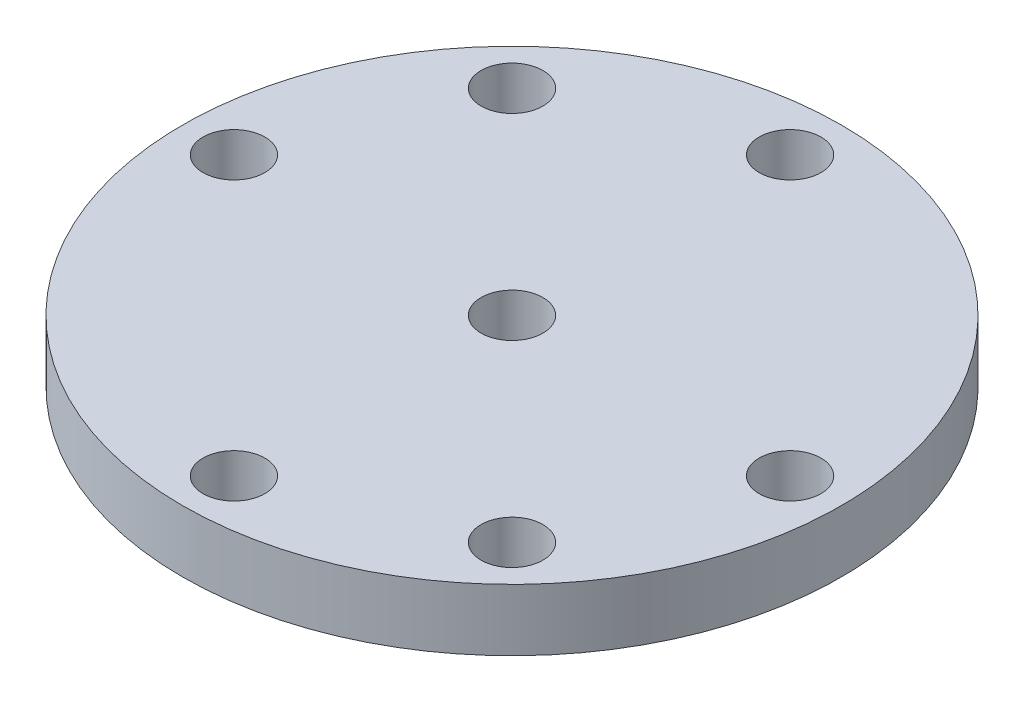
ISO-10303-21;
HEADER;
FILE_DESCRIPTION(('STEP AP214'),'2;1');
FILE_NAME('part.step','',(''),(''),'','','');
FILE_SCHEMA(('AUTOMOTIVE_DESIGN { 1 0 10303 214 1 1 1 1 }'));
ENDSEC;
DATA;
#1=APPLICATION_CONTEXT('core data for automotive mechanical design processes');
#2=APPLICATION_PROTOCOL_DEFINITION('international standard','automotive_design',2000,#1);
#3=PRODUCT_CONTEXT('',#1,'mechanical');
#4=PRODUCT('Part','Part','',(#3));
#5=PRODUCT_RELATED_PRODUCT_CATEGORY('part','',(#4));
#6=PRODUCT_DEFINITION_FORMATION('','',#4);
#7=PRODUCT_DEFINITION_CONTEXT('part definition',#1,'design');
#8=PRODUCT_DEFINITION('design','',#6,#7);
#9=PRODUCT_DEFINITION_SHAPE('','',#8);
#10=(LENGTH_UNIT() NAMED_UNIT(*) SI_UNIT(.MILLI.,.METRE.));
#11=(NAMED_UNIT(*) PLANE_ANGLE_UNIT() SI_UNIT($,.RADIAN.));
#12=(NAMED_UNIT(*) SI_UNIT($,.STERADIAN.) SOLID_ANGLE_UNIT());
#13=UNCERTAINTY_MEASURE_WITH_UNIT(LENGTH_MEASURE(1.E-05),#10,'distance_accuracy_value','');
#14=(GEOMETRIC_REPRESENTATION_CONTEXT(3) GLOBAL_UNCERTAINTY_ASSIGNED_CONTEXT((#13)) GLOBAL_UNIT_ASSIGNED_CONTEXT((#10,
#11,#12)) REPRESENTATION_CONTEXT('',''));
#15=CARTESIAN_POINT('',(0.,0.,0.));
#16=DIRECTION('',(0.,0.,1.));
#17=DIRECTION('',(1.,0.,0.));
#18=AXIS2_PLACEMENT_3D('',#15,#16,#17);
#19=CARTESIAN_POINT('',(0.,6.,0.));
#20=DIRECTION('',(0.,1.,0.));
#21=DIRECTION('',(0.,0.,1.));
#22=AXIS2_PLACEMENT_3D('',#19,#20,#21);
#23=PLANE('',#22);
#24=CARTESIAN_POINT('',(-27.,6.,1.43006584257581E-12));
#25=DIRECTION('',(0.,1.,0.));
#26=DIRECTION('',(0.,0.,1.));
#27=AXIS2_PLACEMENT_3D('',#24,#25,#26);
#28=CIRCLE('',#27,3.00000000000203);
#29=CARTESIAN_POINT('',(-27.,6.,3.00000000000346));
#30=VERTEX_POINT('',#29);
#31=EDGE_CURVE('E71',#30,#30,#28,.T.);
#32=ORIENTED_EDGE('',*,*,#31,.F.);
#33=EDGE_LOOP('',(#32));
#34=FACE_BOUND('',#33,.T.);
#35=CARTESIAN_POINT('',(27.,6.,-1.56144178454891E-12));
#36=DIRECTION('',(0.,1.,0.));
#37=DIRECTION('',(0.,0.,1.));
#38=AXIS2_PLACEMENT_3D('',#35,#36,#37);
#39=CIRCLE('',#38,3.00000000000102);
#40=CARTESIAN_POINT('',(27.,6.,2.99999999999946));
#41=VERTEX_POINT('',#40);
#42=EDGE_CURVE('E59',#41,#41,#39,.T.);
#43=ORIENTED_EDGE('',*,*,#42,.F.);
#44=EDGE_LOOP('',(#43));
#45=FACE_BOUND('',#44,.T.);
#46=CARTESIAN_POINT('',(0.,6.,-27.));
#47=DIRECTION('',(0.,1.,0.));
#48=DIRECTION('',(0.,0.,1.));
#49=AXIS2_PLACEMENT_3D('',#46,#47,#48);
#50=CIRCLE('',#49,3.);
#51=CARTESIAN_POINT('',(0.,6.,-24.));
#52=VERTEX_POINT('',#51);
#53=EDGE_CURVE('E48',#52,#52,#50,.T.);
#54=ORIENTED_EDGE('',*,*,#53,.F.);
#55=EDGE_LOOP('',(#54));
#56=FACE_BOUND('',#55,.T.);
#57=CARTESIAN_POINT('',(0.,6.,0.));
#58=DIRECTION('',(0.,1.,0.));
#59=DIRECTION('',(0.,0.,1.));
#60=AXIS2_PLACEMENT_3D('',#57,#58,#59);
#61=CIRCLE('',#60,32.);
#62=CARTESIAN_POINT('',(0.,6.,32.));
#63=VERTEX_POINT('',#62);
#64=EDGE_CURVE('E11',#63,#63,#61,.T.);
#65=ORIENTED_EDGE('',*,*,#64,.T.);
#66=EDGE_LOOP('',(#65));
#67=FACE_BOUND('',#66,.T.);
#68=CARTESIAN_POINT('',(-19.0918830920368,6.,-19.0918830920367));
#69=DIRECTION('',(0.,1.,0.));
#70=DIRECTION('',(0.,0.,1.));
#71=AXIS2_PLACEMENT_3D('',#68,#69,#70);
#72=CIRCLE('',#71,3.);
#73=CARTESIAN_POINT('',(-19.0918830920368,6.,-16.0918830920367));
#74=VERTEX_POINT('',#73);
#75=EDGE_CURVE('E53',#74,#74,#72,.T.);
#76=ORIENTED_EDGE('',*,*,#75,.F.);
#77=EDGE_LOOP('',(#76));
#78=FACE_BOUND('',#77,.T.);
#79=CARTESIAN_POINT('',(3.06293152576824E-12,6.,27.));
#80=DIRECTION('',(0.,1.,0.));
#81=DIRECTION('',(0.,0.,1.));
#82=AXIS2_PLACEMENT_3D('',#79,#80,#81);
#83=CIRCLE('',#82,3.00000000000288);
#84=CARTESIAN_POINT('',(3.06293152576824E-12,6.,30.0000000000029));
#85=VERTEX_POINT('',#84);
#86=EDGE_CURVE('E65',#85,#85,#83,.T.);
#87=ORIENTED_EDGE('',*,*,#86,.F.);
#88=EDGE_LOOP('',(#87));
#89=FACE_BOUND('',#88,.T.);
#90=CARTESIAN_POINT('',(19.0918830920378,6.,19.0918830920357));
#91=DIRECTION('',(0.,1.,0.));
#92=DIRECTION('',(0.,0.,1.));
#93=AXIS2_PLACEMENT_3D('',#90,#91,#92);
#94=CIRCLE('',#93,3.);
#95=CARTESIAN_POINT('',(19.0918830920378,6.,22.0918830920357));
#96=VERTEX_POINT('',#95);
#97=EDGE_CURVE('E77',#96,#96,#94,.T.);
#98=ORIENTED_EDGE('',*,*,#97,.F.);
#99=EDGE_LOOP('',(#98));
#100=FACE_BOUND('',#99,.T.);
#101=CARTESIAN_POINT('',(0.,6.,0.));
#102=DIRECTION('',(0.,1.,0.));
#103=DIRECTION('',(0.,0.,1.));
#104=AXIS2_PLACEMENT_3D('',#101,#102,#103);
#105=CIRCLE('',#104,3.);
#106=CARTESIAN_POINT('',(0.,6.,3.));
#107=VERTEX_POINT('',#106);
#108=EDGE_CURVE('E86',#107,#107,#105,.T.);
#109=ORIENTED_EDGE('',*,*,#108,.F.);
#110=EDGE_LOOP('',(#109));
#111=FACE_BOUND('',#110,.T.);
#112=ADVANCED_FACE('F37',(#34,#45,#56,#67,#78,#89,#100,#111),#23,.T.);
#113=CARTESIAN_POINT('',(0.,0.,0.));
#114=DIRECTION('',(0.,1.,0.));
#115=DIRECTION('',(0.,0.,1.));
#116=AXIS2_PLACEMENT_3D('',#113,#114,#115);
#117=PLANE('',#116);
#118=CARTESIAN_POINT('',(0.,0.,0.));
#119=DIRECTION('',(0.,1.,0.));
#120=DIRECTION('',(0.,0.,1.));
#121=AXIS2_PLACEMENT_3D('',#118,#119,#120);
#122=CIRCLE('',#121,32.);
#123=CARTESIAN_POINT('',(0.,0.,32.));
#124=VERTEX_POINT('',#123);
#125=EDGE_CURVE('E41',#124,#124,#122,.T.);
#126=ORIENTED_EDGE('',*,*,#125,.F.);
#127=EDGE_LOOP('',(#126));
#128=FACE_BOUND('',#127,.T.);
#129=CARTESIAN_POINT('',(0.,0.,-27.));
#130=DIRECTION('',(0.,1.,0.));
#131=DIRECTION('',(0.,0.,1.));
#132=AXIS2_PLACEMENT_3D('',#129,#130,#131);
#133=CIRCLE('',#132,3.);
#134=CARTESIAN_POINT('',(0.,0.,-24.));
#135=VERTEX_POINT('',#134);
#136=EDGE_CURVE('E50',#135,#135,#133,.T.);
#137=ORIENTED_EDGE('',*,*,#136,.T.);
#138=EDGE_LOOP('',(#137));
#139=FACE_BOUND('',#138,.T.);
#140=CARTESIAN_POINT('',(-19.0918830920368,0.,-19.0918830920367));
#141=DIRECTION('',(0.,1.,0.));
#142=DIRECTION('',(0.,0.,1.));
#143=AXIS2_PLACEMENT_3D('',#140,#141,#142);
#144=CIRCLE('',#143,3.);
#145=CARTESIAN_POINT('',(-19.0918830920368,0.,-16.0918830920367));
#146=VERTEX_POINT('',#145);
#147=EDGE_CURVE('E56',#146,#146,#144,.T.);
#148=ORIENTED_EDGE('',*,*,#147,.T.);
#149=EDGE_LOOP('',(#148));
#150=FACE_BOUND('',#149,.T.);
#151=CARTESIAN_POINT('',(27.,0.,-1.56144178454891E-12));
#152=DIRECTION('',(0.,1.,0.));
#153=DIRECTION('',(0.,0.,1.));
#154=AXIS2_PLACEMENT_3D('',#151,#152,#153);
#155=CIRCLE('',#154,3.00000000000102);
#156=CARTESIAN_POINT('',(27.,0.,2.99999999999946));
#157=VERTEX_POINT('',#156);
#158=EDGE_CURVE('E62',#157,#157,#155,.T.);
#159=ORIENTED_EDGE('',*,*,#158,.T.);
#160=EDGE_LOOP('',(#159));
#161=FACE_BOUND('',#160,.T.);
#162=CARTESIAN_POINT('',(3.06293152576824E-12,0.,27.));
#163=DIRECTION('',(0.,1.,0.));
#164=DIRECTION('',(0.,0.,1.));
#165=AXIS2_PLACEMENT_3D('',#162,#163,#164);
#166=CIRCLE('',#165,3.00000000000288);
#167=CARTESIAN_POINT('',(3.06293152576824E-12,0.,30.0000000000029));
#168=VERTEX_POINT('',#167);
#169=EDGE_CURVE('E68',#168,#168,#166,.T.);
#170=ORIENTED_EDGE('',*,*,#169,.T.);
#171=EDGE_LOOP('',(#170));
#172=FACE_BOUND('',#171,.T.);
#173=CARTESIAN_POINT('',(-27.,0.,1.43006584257581E-12));
#174=DIRECTION('',(0.,1.,0.));
#175=DIRECTION('',(0.,0.,1.));
#176=AXIS2_PLACEMENT_3D('',#173,#174,#175);
#177=CIRCLE('',#176,3.00000000000203);
#178=CARTESIAN_POINT('',(-27.,0.,3.00000000000346));
#179=VERTEX_POINT('',#178);
#180=EDGE_CURVE('E74',#179,#179,#177,.T.);
#181=ORIENTED_EDGE('',*,*,#180,.T.);
#182=EDGE_LOOP('',(#181));
#183=FACE_BOUND('',#182,.T.);
#184=CARTESIAN_POINT('',(19.0918830920378,0.,19.0918830920357));
#185=DIRECTION('',(0.,1.,0.));
#186=DIRECTION('',(0.,0.,1.));
#187=AXIS2_PLACEMENT_3D('',#184,#185,#186);
#188=CIRCLE('',#187,3.);
#189=CARTESIAN_POINT('',(19.0918830920378,0.,22.0918830920357));
#190=VERTEX_POINT('',#189);
#191=EDGE_CURVE('E80',#190,#190,#188,.T.);
#192=ORIENTED_EDGE('',*,*,#191,.T.);
#193=EDGE_LOOP('',(#192));
#194=FACE_BOUND('',#193,.T.);
#195=CARTESIAN_POINT('',(0.,0.,0.));
#196=DIRECTION('',(0.,1.,0.));
#197=DIRECTION('',(0.,0.,1.));
#198=AXIS2_PLACEMENT_3D('',#195,#196,#197);
#199=CIRCLE('',#198,3.);
#200=CARTESIAN_POINT('',(0.,0.,3.));
#201=VERTEX_POINT('',#200);
#202=EDGE_CURVE('E83',#201,#201,#199,.T.);
#203=ORIENTED_EDGE('',*,*,#202,.T.);
#204=EDGE_LOOP('',(#203));
#205=FACE_BOUND('',#204,.T.);
#206=ADVANCED_FACE('F92',(#128,#139,#150,#161,#172,#183,#194,#205),#117,.F.);
#207=CARTESIAN_POINT('',(0.,6.,0.));
#208=DIRECTION('',(0.,-1.,0.));
#209=DIRECTION('',(0.,0.,-1.));
#210=AXIS2_PLACEMENT_3D('',#207,#208,#209);
#211=CYLINDRICAL_SURFACE('',#210,32.);
#212=ORIENTED_EDGE('',*,*,#64,.F.);
#213=EDGE_LOOP('',(#212));
#214=FACE_BOUND('',#213,.T.);
#215=ORIENTED_EDGE('',*,*,#125,.T.);
#216=EDGE_LOOP('',(#215));
#217=FACE_BOUND('',#216,.T.);
#218=ADVANCED_FACE('F39',(#214,#217),#211,.T.);
#219=CARTESIAN_POINT('',(0.,6.,-27.));
#220=DIRECTION('',(0.,-1.,0.));
#221=DIRECTION('',(0.,0.,-1.));
#222=AXIS2_PLACEMENT_3D('',#219,#220,#221);
#223=CYLINDRICAL_SURFACE('',#222,3.);
#224=ORIENTED_EDGE('',*,*,#53,.T.);
#225=EDGE_LOOP('',(#224));
#226=FACE_BOUND('',#225,.T.);
#227=ORIENTED_EDGE('',*,*,#136,.F.);
#228=EDGE_LOOP('',(#227));
#229=FACE_BOUND('',#228,.T.);
#230=ADVANCED_FACE('F111',(#226,#229),#223,.F.);
#231=CARTESIAN_POINT('',(-19.0918830920368,6.,-19.0918830920367));
#232=DIRECTION('',(0.,-1.,0.));
#233=DIRECTION('',(0.,0.,-1.));
#234=AXIS2_PLACEMENT_3D('',#231,#232,#233);
#235=CYLINDRICAL_SURFACE('',#234,3.);
#236=ORIENTED_EDGE('',*,*,#75,.T.);
#237=EDGE_LOOP('',(#236));
#238=FACE_BOUND('',#237,.T.);
#239=ORIENTED_EDGE('',*,*,#147,.F.);
#240=EDGE_LOOP('',(#239));
#241=FACE_BOUND('',#240,.T.);
#242=ADVANCED_FACE('F114',(#238,#241),#235,.F.);
#243=CARTESIAN_POINT('',(27.,6.,-1.56144178454891E-12));
#244=DIRECTION('',(0.,-1.,0.));
#245=DIRECTION('',(0.,0.,-1.));
#246=AXIS2_PLACEMENT_3D('',#243,#244,#245);
#247=CYLINDRICAL_SURFACE('',#246,3.00000000000102);
#248=ORIENTED_EDGE('',*,*,#42,.T.);
#249=EDGE_LOOP('',(#248));
#250=FACE_BOUND('',#249,.T.);
#251=ORIENTED_EDGE('',*,*,#158,.F.);
#252=EDGE_LOOP('',(#251));
#253=FACE_BOUND('',#252,.T.);
#254=ADVANCED_FACE('F118',(#250,#253),#247,.F.);
#255=CARTESIAN_POINT('',(3.06293152576824E-12,6.,27.));
#256=DIRECTION('',(0.,-1.,0.));
#257=DIRECTION('',(0.,0.,-1.));
#258=AXIS2_PLACEMENT_3D('',#255,#256,#257);
#259=CYLINDRICAL_SURFACE('',#258,3.00000000000288);
#260=ORIENTED_EDGE('',*,*,#86,.T.);
#261=EDGE_LOOP('',(#260));
#262=FACE_BOUND('',#261,.T.);
#263=ORIENTED_EDGE('',*,*,#169,.F.);
#264=EDGE_LOOP('',(#263));
#265=FACE_BOUND('',#264,.T.);
#266=ADVANCED_FACE('F122',(#262,#265),#259,.F.);
#267=CARTESIAN_POINT('',(-27.,6.,1.43006584257581E-12));
#268=DIRECTION('',(0.,-1.,0.));
#269=DIRECTION('',(0.,0.,-1.));
#270=AXIS2_PLACEMENT_3D('',#267,#268,#269);
#271=CYLINDRICAL_SURFACE('',#270,3.00000000000203);
#272=ORIENTED_EDGE('',*,*,#31,.T.);
#273=EDGE_LOOP('',(#272));
#274=FACE_BOUND('',#273,.T.);
#275=ORIENTED_EDGE('',*,*,#180,.F.);
#276=EDGE_LOOP('',(#275));
#277=FACE_BOUND('',#276,.T.);
#278=ADVANCED_FACE('F126',(#274,#277),#271,.F.);
#279=CARTESIAN_POINT('',(19.0918830920378,6.,19.0918830920357));
#280=DIRECTION('',(0.,-1.,0.));
#281=DIRECTION('',(0.,0.,-1.));
#282=AXIS2_PLACEMENT_3D('',#279,#280,#281);
#283=CYLINDRICAL_SURFACE('',#282,3.);
#284=ORIENTED_EDGE('',*,*,#97,.T.);
#285=EDGE_LOOP('',(#284));
#286=FACE_BOUND('',#285,.T.);
#287=ORIENTED_EDGE('',*,*,#191,.F.);
#288=EDGE_LOOP('',(#287));
#289=FACE_BOUND('',#288,.T.);
#290=ADVANCED_FACE('F97',(#286,#289),#283,.F.);
#291=CARTESIAN_POINT('',(0.,0.,0.));
#292=DIRECTION('',(0.,1.,0.));
#293=DIRECTION('',(0.,0.,1.));
#294=AXIS2_PLACEMENT_3D('',#291,#292,#293);
#295=CYLINDRICAL_SURFACE('',#294,3.);
#296=ORIENTED_EDGE('',*,*,#202,.F.);
#297=EDGE_LOOP('',(#296));
#298=FACE_BOUND('',#297,.T.);
#299=ORIENTED_EDGE('',*,*,#108,.T.);
#300=EDGE_LOOP('',(#299));
#301=FACE_BOUND('',#300,.T.);
#302=ADVANCED_FACE('F94',(#298,#301),#295,.F.);
#303=CLOSED_SHELL('',(#112,#206,#218,#230,#242,#254,#266,#278,#290,#302));
#304=MANIFOLD_SOLID_BREP('B2',#303);
#305=ADVANCED_BREP_SHAPE_REPRESENTATION('',(#18,#304),#14);
#306=SHAPE_DEFINITION_REPRESENTATION(#9,#305);
ENDSEC;
END-ISO-10303-21;
